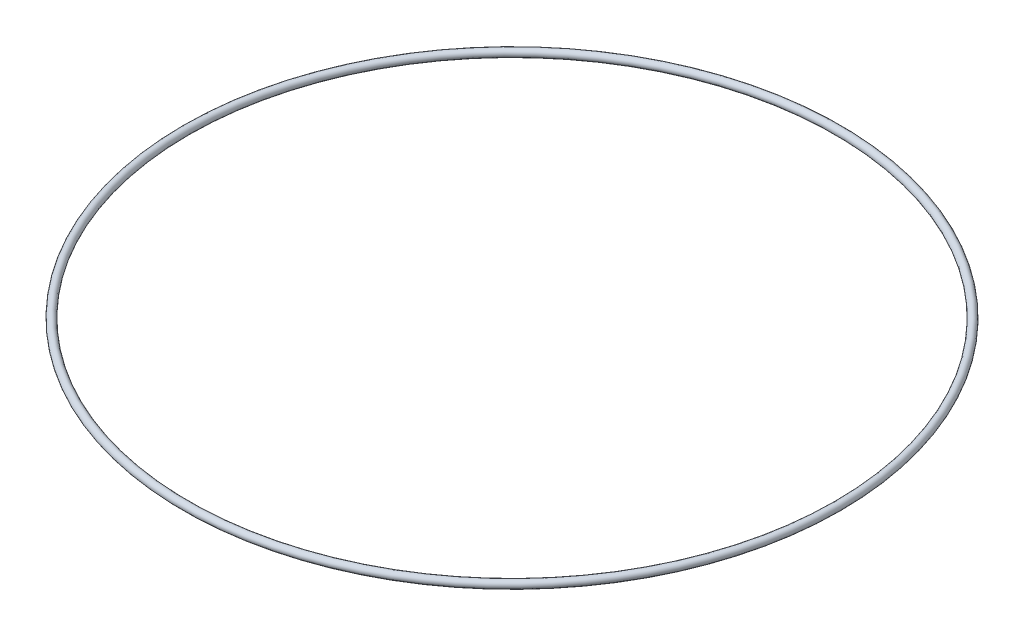
ISO-10303-21;
HEADER;
FILE_DESCRIPTION(('STEP AP214'),'2;1');
FILE_NAME('part.step','',(''),(''),'','','');
FILE_SCHEMA(('AUTOMOTIVE_DESIGN { 1 0 10303 214 1 1 1 1 }'));
ENDSEC;
DATA;
#1=APPLICATION_CONTEXT('core data for automotive mechanical design processes');
#2=APPLICATION_PROTOCOL_DEFINITION('international standard','automotive_design',2000,#1);
#3=PRODUCT_CONTEXT('',#1,'mechanical');
#4=PRODUCT('Part','Part','',(#3));
#5=PRODUCT_RELATED_PRODUCT_CATEGORY('part','',(#4));
#6=PRODUCT_DEFINITION_FORMATION('','',#4);
#7=PRODUCT_DEFINITION_CONTEXT('part definition',#1,'design');
#8=PRODUCT_DEFINITION('design','',#6,#7);
#9=PRODUCT_DEFINITION_SHAPE('','',#8);
#10=(LENGTH_UNIT() NAMED_UNIT(*) SI_UNIT(.MILLI.,.METRE.));
#11=(NAMED_UNIT(*) PLANE_ANGLE_UNIT() SI_UNIT($,.RADIAN.));
#12=(NAMED_UNIT(*) SI_UNIT($,.STERADIAN.) SOLID_ANGLE_UNIT());
#13=UNCERTAINTY_MEASURE_WITH_UNIT(LENGTH_MEASURE(1.E-05),#10,'distance_accuracy_value','');
#14=(GEOMETRIC_REPRESENTATION_CONTEXT(3) GLOBAL_UNCERTAINTY_ASSIGNED_CONTEXT((#13)) GLOBAL_UNIT_ASSIGNED_CONTEXT((#10,
#11,#12)) REPRESENTATION_CONTEXT('',''));
#15=CARTESIAN_POINT('',(0.,0.,0.));
#16=DIRECTION('',(0.,0.,1.));
#17=DIRECTION('',(1.,0.,0.));
#18=AXIS2_PLACEMENT_3D('',#15,#16,#17);
#19=CARTESIAN_POINT('',(0.,0.,0.));
#20=DIRECTION('',(0.,1.,0.));
#21=DIRECTION('',(0.,0.,1.));
#22=AXIS2_PLACEMENT_3D('',#19,#20,#21);
#23=TOROIDAL_SURFACE('',#22,75.,0.889000000000003);
#24=CARTESIAN_POINT('',(75.,0.,0.));
#25=DIRECTION('',(0.,0.,1.));
#26=DIRECTION('',(1.,0.,0.));
#27=AXIS2_PLACEMENT_3D('',#24,#25,#26);
#28=CIRCLE('',#27,0.889000000000003);
#29=CARTESIAN_POINT('',(75.889,0.,0.));
#30=VERTEX_POINT('',#29);
#31=EDGE_CURVE('E10',#30,#30,#28,.T.);
#32=CARTESIAN_POINT('',(0.,0.,0.));
#33=DIRECTION('',(0.,1.,0.));
#34=DIRECTION('',(0.,0.,1.));
#35=AXIS2_PLACEMENT_3D('',#32,#33,#34);
#36=CIRCLE('',#35,75.889);
#37=EDGE_CURVE('',#30,#30,#36,.T.);
#38=ORIENTED_EDGE('',*,*,#31,.F.);
#39=ORIENTED_EDGE('',*,*,#31,.T.);
#40=ORIENTED_EDGE('',*,*,#37,.T.);
#41=ORIENTED_EDGE('',*,*,#37,.F.);
#42=EDGE_LOOP('',(#38,#40,#39,#41));
#43=FACE_BOUND('',#42,.T.);
#44=ADVANCED_FACE('F43',(#43),#23,.T.);
#45=CLOSED_SHELL('',(#44));
#46=MANIFOLD_SOLID_BREP('B2',#45);
#47=ADVANCED_BREP_SHAPE_REPRESENTATION('',(#18,#46),#14);
#48=SHAPE_DEFINITION_REPRESENTATION(#9,#47);
ENDSEC;
END-ISO-10303-21;
